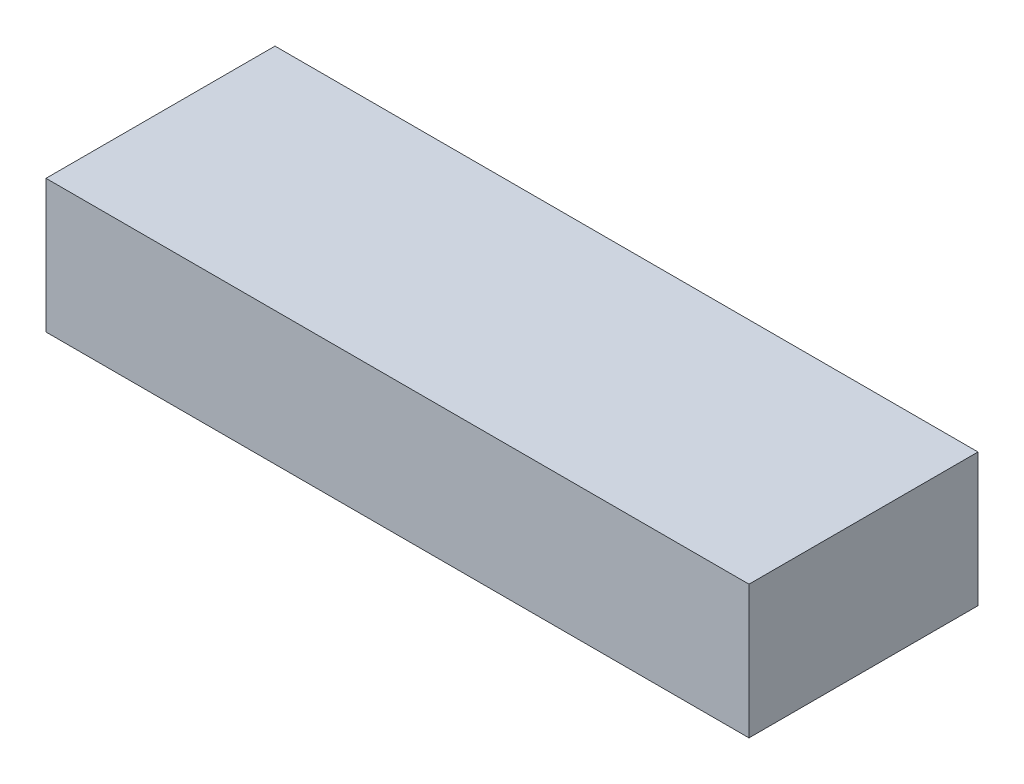
ISO-10303-21;
HEADER;
FILE_DESCRIPTION(('STEP AP214'),'2;1');
FILE_NAME('part.step','',(''),(''),'','','');
FILE_SCHEMA(('AUTOMOTIVE_DESIGN { 1 0 10303 214 1 1 1 1 }'));
ENDSEC;
DATA;
#1=APPLICATION_CONTEXT('core data for automotive mechanical design processes');
#2=APPLICATION_PROTOCOL_DEFINITION('international standard','automotive_design',2000,#1);
#3=PRODUCT_CONTEXT('',#1,'mechanical');
#4=PRODUCT('Part','Part','',(#3));
#5=PRODUCT_RELATED_PRODUCT_CATEGORY('part','',(#4));
#6=PRODUCT_DEFINITION_FORMATION('','',#4);
#7=PRODUCT_DEFINITION_CONTEXT('part definition',#1,'design');
#8=PRODUCT_DEFINITION('design','',#6,#7);
#9=PRODUCT_DEFINITION_SHAPE('','',#8);
#10=(LENGTH_UNIT() NAMED_UNIT(*) SI_UNIT(.MILLI.,.METRE.));
#11=(NAMED_UNIT(*) PLANE_ANGLE_UNIT() SI_UNIT($,.RADIAN.));
#12=(NAMED_UNIT(*) SI_UNIT($,.STERADIAN.) SOLID_ANGLE_UNIT());
#13=UNCERTAINTY_MEASURE_WITH_UNIT(LENGTH_MEASURE(1.E-05),#10,'distance_accuracy_value','');
#14=(GEOMETRIC_REPRESENTATION_CONTEXT(3) GLOBAL_UNCERTAINTY_ASSIGNED_CONTEXT((#13)) GLOBAL_UNIT_ASSIGNED_CONTEXT((#10,
#11,#12)) REPRESENTATION_CONTEXT('',''));
#15=CARTESIAN_POINT('',(0.,0.,0.));
#16=DIRECTION('',(0.,0.,1.));
#17=DIRECTION('',(1.,0.,0.));
#18=AXIS2_PLACEMENT_3D('',#15,#16,#17);
#19=CARTESIAN_POINT('',(0.,25.,0.));
#20=DIRECTION('',(1.,0.,0.));
#21=DIRECTION('',(0.,0.,-1.));
#22=AXIS2_PLACEMENT_3D('',#19,#20,#21);
#23=PLANE('',#22);
#24=DIRECTION('',(0.,0.,1.));
#25=VECTOR('',#24,1.);
#26=CARTESIAN_POINT('',(0.,0.,0.));
#27=LINE('',#26,#25);
#28=CARTESIAN_POINT('',(0.,0.,-43.));
#29=VERTEX_POINT('',#28);
#30=CARTESIAN_POINT('',(0.,0.,0.));
#31=VERTEX_POINT('',#30);
#32=EDGE_CURVE('E104',#29,#31,#27,.T.);
#33=ORIENTED_EDGE('',*,*,#32,.T.);
#34=DIRECTION('',(0.,-1.,0.));
#35=VECTOR('',#34,1.);
#36=CARTESIAN_POINT('',(0.,25.,0.));
#37=LINE('',#36,#35);
#38=CARTESIAN_POINT('',(0.,25.,0.));
#39=VERTEX_POINT('',#38);
#40=EDGE_CURVE('E11',#39,#31,#37,.T.);
#41=ORIENTED_EDGE('',*,*,#40,.F.);
#42=DIRECTION('',(0.,0.,1.));
#43=VECTOR('',#42,1.);
#44=CARTESIAN_POINT('',(0.,25.,0.));
#45=LINE('',#44,#43);
#46=CARTESIAN_POINT('',(0.,25.,-43.));
#47=VERTEX_POINT('',#46);
#48=EDGE_CURVE('E92',#47,#39,#45,.T.);
#49=ORIENTED_EDGE('',*,*,#48,.F.);
#50=DIRECTION('',(0.,-1.,0.));
#51=VECTOR('',#50,1.);
#52=CARTESIAN_POINT('',(0.,25.,-43.));
#53=LINE('',#52,#51);
#54=EDGE_CURVE('E100',#47,#29,#53,.T.);
#55=ORIENTED_EDGE('',*,*,#54,.T.);
#56=EDGE_LOOP('',(#33,#41,#49,#55));
#57=FACE_BOUND('',#56,.T.);
#58=ADVANCED_FACE('F41',(#57),#23,.F.);
#59=CARTESIAN_POINT('',(0.,25.,0.));
#60=DIRECTION('',(0.,0.,-1.));
#61=DIRECTION('',(-1.,0.,0.));
#62=AXIS2_PLACEMENT_3D('',#59,#60,#61);
#63=PLANE('',#62);
#64=DIRECTION('',(1.,0.,0.));
#65=VECTOR('',#64,1.);
#66=CARTESIAN_POINT('',(0.,0.,0.));
#67=LINE('',#66,#65);
#68=CARTESIAN_POINT('',(132.,0.,0.));
#69=VERTEX_POINT('',#68);
#70=EDGE_CURVE('E96',#31,#69,#67,.T.);
#71=ORIENTED_EDGE('',*,*,#70,.T.);
#72=DIRECTION('',(0.,-1.,0.));
#73=VECTOR('',#72,1.);
#74=CARTESIAN_POINT('',(132.,25.,0.));
#75=LINE('',#74,#73);
#76=CARTESIAN_POINT('',(132.,25.,0.));
#77=VERTEX_POINT('',#76);
#78=EDGE_CURVE('E49',#77,#69,#75,.T.);
#79=ORIENTED_EDGE('',*,*,#78,.F.);
#80=DIRECTION('',(1.,0.,0.));
#81=VECTOR('',#80,1.);
#82=CARTESIAN_POINT('',(0.,25.,0.));
#83=LINE('',#82,#81);
#84=EDGE_CURVE('E87',#39,#77,#83,.T.);
#85=ORIENTED_EDGE('',*,*,#84,.F.);
#86=ORIENTED_EDGE('',*,*,#40,.T.);
#87=EDGE_LOOP('',(#71,#79,#85,#86));
#88=FACE_BOUND('',#87,.T.);
#89=ADVANCED_FACE('F95',(#88),#63,.F.);
#90=CARTESIAN_POINT('',(132.,25.,0.));
#91=DIRECTION('',(-1.,0.,0.));
#92=DIRECTION('',(0.,0.,1.));
#93=AXIS2_PLACEMENT_3D('',#90,#91,#92);
#94=PLANE('',#93);
#95=DIRECTION('',(0.,0.,-1.));
#96=VECTOR('',#95,1.);
#97=CARTESIAN_POINT('',(132.,0.,0.));
#98=LINE('',#97,#96);
#99=CARTESIAN_POINT('',(132.,0.,-43.));
#100=VERTEX_POINT('',#99);
#101=EDGE_CURVE('E74',#69,#100,#98,.T.);
#102=ORIENTED_EDGE('',*,*,#101,.T.);
#103=DIRECTION('',(0.,-1.,0.));
#104=VECTOR('',#103,1.);
#105=CARTESIAN_POINT('',(132.,25.,-43.));
#106=LINE('',#105,#104);
#107=CARTESIAN_POINT('',(132.,25.,-43.));
#108=VERTEX_POINT('',#107);
#109=EDGE_CURVE('E97',#108,#100,#106,.T.);
#110=ORIENTED_EDGE('',*,*,#109,.F.);
#111=DIRECTION('',(0.,0.,-1.));
#112=VECTOR('',#111,1.);
#113=CARTESIAN_POINT('',(132.,25.,0.));
#114=LINE('',#113,#112);
#115=EDGE_CURVE('E90',#77,#108,#114,.T.);
#116=ORIENTED_EDGE('',*,*,#115,.F.);
#117=ORIENTED_EDGE('',*,*,#78,.T.);
#118=EDGE_LOOP('',(#102,#110,#116,#117));
#119=FACE_BOUND('',#118,.T.);
#120=ADVANCED_FACE('F98',(#119),#94,.F.);
#121=CARTESIAN_POINT('',(0.,25.,-43.));
#122=DIRECTION('',(0.,0.,1.));
#123=DIRECTION('',(1.,0.,0.));
#124=AXIS2_PLACEMENT_3D('',#121,#122,#123);
#125=PLANE('',#124);
#126=DIRECTION('',(-1.,0.,0.));
#127=VECTOR('',#126,1.);
#128=CARTESIAN_POINT('',(0.,0.,-43.));
#129=LINE('',#128,#127);
#130=EDGE_CURVE('E80',#100,#29,#129,.T.);
#131=ORIENTED_EDGE('',*,*,#130,.T.);
#132=ORIENTED_EDGE('',*,*,#54,.F.);
#133=DIRECTION('',(-1.,0.,0.));
#134=VECTOR('',#133,1.);
#135=CARTESIAN_POINT('',(0.,25.,-43.));
#136=LINE('',#135,#134);
#137=EDGE_CURVE('E57',#108,#47,#136,.T.);
#138=ORIENTED_EDGE('',*,*,#137,.F.);
#139=ORIENTED_EDGE('',*,*,#109,.T.);
#140=EDGE_LOOP('',(#131,#132,#138,#139));
#141=FACE_BOUND('',#140,.T.);
#142=ADVANCED_FACE('F111',(#141),#125,.F.);
#143=CARTESIAN_POINT('',(0.,25.,0.));
#144=DIRECTION('',(0.,-1.,0.));
#145=DIRECTION('',(0.,0.,-1.));
#146=AXIS2_PLACEMENT_3D('',#143,#144,#145);
#147=PLANE('',#146);
#148=ORIENTED_EDGE('',*,*,#48,.T.);
#149=ORIENTED_EDGE('',*,*,#84,.T.);
#150=ORIENTED_EDGE('',*,*,#115,.T.);
#151=ORIENTED_EDGE('',*,*,#137,.T.);
#152=EDGE_LOOP('',(#148,#149,#150,#151));
#153=FACE_BOUND('',#152,.T.);
#154=ADVANCED_FACE('F88',(#153),#147,.F.);
#155=CARTESIAN_POINT('',(0.,0.,0.));
#156=DIRECTION('',(0.,-1.,0.));
#157=DIRECTION('',(0.,0.,-1.));
#158=AXIS2_PLACEMENT_3D('',#155,#156,#157);
#159=PLANE('',#158);
#160=ORIENTED_EDGE('',*,*,#32,.F.);
#161=ORIENTED_EDGE('',*,*,#130,.F.);
#162=ORIENTED_EDGE('',*,*,#101,.F.);
#163=ORIENTED_EDGE('',*,*,#70,.F.);
#164=EDGE_LOOP('',(#160,#161,#162,#163));
#165=FACE_BOUND('',#164,.T.);
#166=ADVANCED_FACE('F114',(#165),#159,.T.);
#167=CLOSED_SHELL('',(#58,#89,#120,#142,#154,#166));
#168=MANIFOLD_SOLID_BREP('B2',#167);
#169=ADVANCED_BREP_SHAPE_REPRESENTATION('',(#18,#168),#14);
#170=SHAPE_DEFINITION_REPRESENTATION(#9,#169);
ENDSEC;
END-ISO-10303-21;
